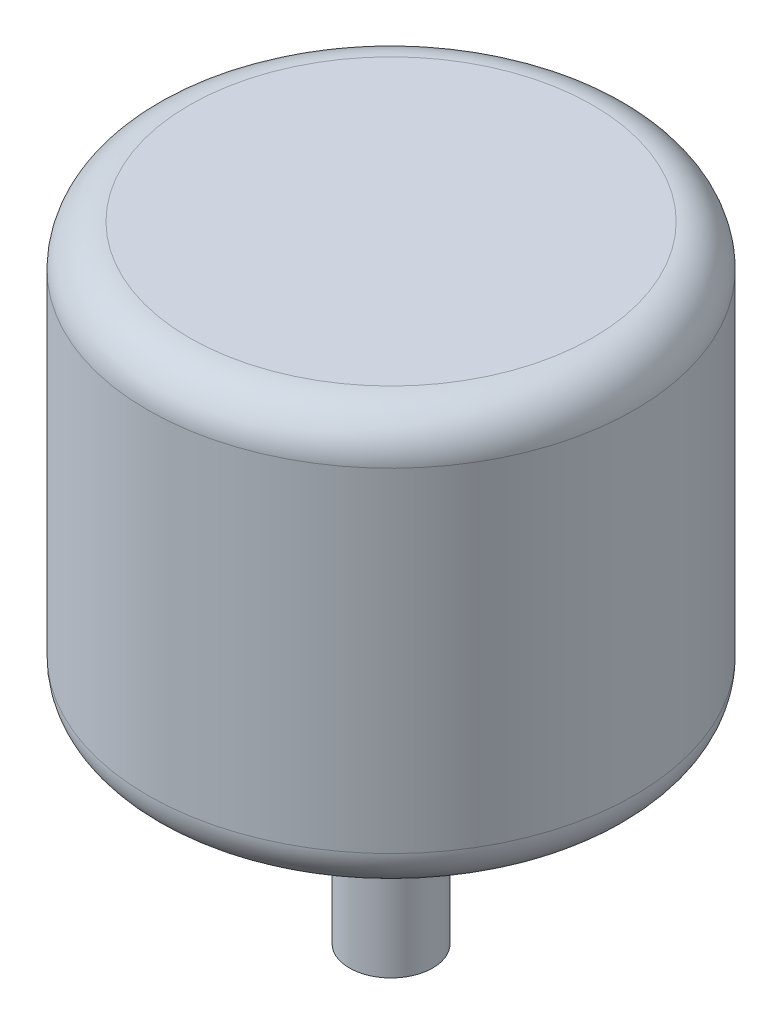
ISO-10303-21;
HEADER;
FILE_DESCRIPTION(('STEP AP214'),'2;1');
FILE_NAME('part.step','',(''),(''),'','','');
FILE_SCHEMA(('AUTOMOTIVE_DESIGN { 1 0 10303 214 1 1 1 1 }'));
ENDSEC;
DATA;
#1=APPLICATION_CONTEXT('core data for automotive mechanical design processes');
#2=APPLICATION_PROTOCOL_DEFINITION('international standard','automotive_design',2000,#1);
#3=PRODUCT_CONTEXT('',#1,'mechanical');
#4=PRODUCT('Part','Part','',(#3));
#5=PRODUCT_RELATED_PRODUCT_CATEGORY('part','',(#4));
#6=PRODUCT_DEFINITION_FORMATION('','',#4);
#7=PRODUCT_DEFINITION_CONTEXT('part definition',#1,'design');
#8=PRODUCT_DEFINITION('design','',#6,#7);
#9=PRODUCT_DEFINITION_SHAPE('','',#8);
#10=(LENGTH_UNIT() NAMED_UNIT(*) SI_UNIT(.MILLI.,.METRE.));
#11=(NAMED_UNIT(*) PLANE_ANGLE_UNIT() SI_UNIT($,.RADIAN.));
#12=(NAMED_UNIT(*) SI_UNIT($,.STERADIAN.) SOLID_ANGLE_UNIT());
#13=UNCERTAINTY_MEASURE_WITH_UNIT(LENGTH_MEASURE(1.E-05),#10,'distance_accuracy_value','');
#14=(GEOMETRIC_REPRESENTATION_CONTEXT(3) GLOBAL_UNCERTAINTY_ASSIGNED_CONTEXT((#13)) GLOBAL_UNIT_ASSIGNED_CONTEXT((#10,
#11,#12)) REPRESENTATION_CONTEXT('',''));
#15=CARTESIAN_POINT('',(0.,0.,0.));
#16=DIRECTION('',(0.,0.,1.));
#17=DIRECTION('',(1.,0.,0.));
#18=AXIS2_PLACEMENT_3D('',#15,#16,#17);
#19=CARTESIAN_POINT('',(0.,30.,0.));
#20=DIRECTION('',(0.,-1.,0.));
#21=DIRECTION('',(0.,0.,-1.));
#22=AXIS2_PLACEMENT_3D('',#19,#20,#21);
#23=CYLINDRICAL_SURFACE('',#22,17.5);
#24=CARTESIAN_POINT('',(0.,27.,0.));
#25=DIRECTION('',(0.,1.,0.));
#26=DIRECTION('',(0.,0.,1.));
#27=AXIS2_PLACEMENT_3D('',#24,#25,#26);
#28=CIRCLE('',#27,17.5);
#29=CARTESIAN_POINT('',(0.,27.,17.5));
#30=VERTEX_POINT('',#29);
#31=EDGE_CURVE('E51',#30,#30,#28,.F.);
#32=ORIENTED_EDGE('',*,*,#31,.T.);
#33=EDGE_LOOP('',(#32));
#34=FACE_BOUND('',#33,.T.);
#35=CARTESIAN_POINT('',(0.,3.,0.));
#36=DIRECTION('',(0.,1.,0.));
#37=DIRECTION('',(0.,0.,1.));
#38=AXIS2_PLACEMENT_3D('',#35,#36,#37);
#39=CIRCLE('',#38,17.5);
#40=CARTESIAN_POINT('',(0.,3.,17.5));
#41=VERTEX_POINT('',#40);
#42=EDGE_CURVE('E56',#41,#41,#39,.T.);
#43=ORIENTED_EDGE('',*,*,#42,.T.);
#44=EDGE_LOOP('',(#43));
#45=FACE_BOUND('',#44,.T.);
#46=ADVANCED_FACE('F43',(#34,#45),#23,.T.);
#47=CARTESIAN_POINT('',(0.,30.,0.));
#48=DIRECTION('',(0.,1.,0.));
#49=DIRECTION('',(0.,0.,1.));
#50=AXIS2_PLACEMENT_3D('',#47,#48,#49);
#51=PLANE('',#50);
#52=CARTESIAN_POINT('',(0.,30.,0.));
#53=DIRECTION('',(0.,1.,0.));
#54=DIRECTION('',(0.,0.,1.));
#55=AXIS2_PLACEMENT_3D('',#52,#53,#54);
#56=CIRCLE('',#55,14.5);
#57=CARTESIAN_POINT('',(0.,30.,14.5));
#58=VERTEX_POINT('',#57);
#59=EDGE_CURVE('E80',#58,#58,#56,.T.);
#60=ORIENTED_EDGE('',*,*,#59,.T.);
#61=EDGE_LOOP('',(#60));
#62=FACE_BOUND('',#61,.T.);
#63=ADVANCED_FACE('F106',(#62),#51,.T.);
#64=CARTESIAN_POINT('',(0.,0.,0.));
#65=DIRECTION('',(0.,1.,0.));
#66=DIRECTION('',(0.,0.,1.));
#67=AXIS2_PLACEMENT_3D('',#64,#65,#66);
#68=PLANE('',#67);
#69=CARTESIAN_POINT('',(7.28770078599683,0.,3.29991170393618));
#70=DIRECTION('',(0.,1.,0.));
#71=DIRECTION('',(0.,0.,1.));
#72=AXIS2_PLACEMENT_3D('',#69,#70,#71);
#73=CIRCLE('',#72,1.50000000000008);
#74=CARTESIAN_POINT('',(7.28770078599683,0.,4.79991170393625));
#75=VERTEX_POINT('',#74);
#76=EDGE_CURVE('E47',#75,#75,#73,.T.);
#77=ORIENTED_EDGE('',*,*,#76,.T.);
#78=EDGE_LOOP('',(#77));
#79=FACE_BOUND('',#78,.T.);
#80=CARTESIAN_POINT('',(3.29991170393606,0.,-7.28770078599739));
#81=DIRECTION('',(0.,1.,0.));
#82=DIRECTION('',(0.,0.,1.));
#83=AXIS2_PLACEMENT_3D('',#80,#81,#82);
#84=CIRCLE('',#83,1.50000000000011);
#85=CARTESIAN_POINT('',(3.29991170393606,0.,-5.78770078599727));
#86=VERTEX_POINT('',#85);
#87=EDGE_CURVE('E66',#86,#86,#84,.T.);
#88=ORIENTED_EDGE('',*,*,#87,.T.);
#89=EDGE_LOOP('',(#88));
#90=FACE_BOUND('',#89,.T.);
#91=CARTESIAN_POINT('',(-7.28770078599761,0.,-3.29991170393662));
#92=DIRECTION('',(0.,1.,0.));
#93=DIRECTION('',(0.,0.,1.));
#94=AXIS2_PLACEMENT_3D('',#91,#92,#93);
#95=CIRCLE('',#94,1.50000000000016);
#96=CARTESIAN_POINT('',(-7.28770078599761,0.,-1.79991170393646));
#97=VERTEX_POINT('',#96);
#98=EDGE_CURVE('E63',#97,#97,#95,.T.);
#99=ORIENTED_EDGE('',*,*,#98,.T.);
#100=EDGE_LOOP('',(#99));
#101=FACE_BOUND('',#100,.T.);
#102=CARTESIAN_POINT('',(-3.29991170393662,0.,7.28770078599705));
#103=DIRECTION('',(0.,1.,0.));
#104=DIRECTION('',(0.,0.,1.));
#105=AXIS2_PLACEMENT_3D('',#102,#103,#104);
#106=CIRCLE('',#105,1.50000000000012);
#107=CARTESIAN_POINT('',(-3.29991170393662,0.,8.78770078599718));
#108=VERTEX_POINT('',#107);
#109=EDGE_CURVE('E60',#108,#108,#106,.T.);
#110=ORIENTED_EDGE('',*,*,#109,.T.);
#111=EDGE_LOOP('',(#110));
#112=FACE_BOUND('',#111,.T.);
#113=CARTESIAN_POINT('',(0.,0.,0.));
#114=DIRECTION('',(0.,1.,0.));
#115=DIRECTION('',(0.,0.,1.));
#116=AXIS2_PLACEMENT_3D('',#113,#114,#115);
#117=CIRCLE('',#116,14.5);
#118=CARTESIAN_POINT('',(0.,0.,14.5));
#119=VERTEX_POINT('',#118);
#120=EDGE_CURVE('E10',#119,#119,#117,.F.);
#121=ORIENTED_EDGE('',*,*,#120,.T.);
#122=EDGE_LOOP('',(#121));
#123=FACE_BOUND('',#122,.T.);
#124=CARTESIAN_POINT('',(0.,0.,0.));
#125=DIRECTION('',(0.,-1.,0.));
#126=DIRECTION('',(0.,0.,-1.));
#127=AXIS2_PLACEMENT_3D('',#124,#125,#126);
#128=CIRCLE('',#127,3.);
#129=CARTESIAN_POINT('',(0.,0.,-3.));
#130=VERTEX_POINT('',#129);
#131=EDGE_CURVE('E75',#130,#130,#128,.T.);
#132=ORIENTED_EDGE('',*,*,#131,.F.);
#133=EDGE_LOOP('',(#132));
#134=FACE_BOUND('',#133,.T.);
#135=ADVANCED_FACE('F113',(#79,#90,#101,#112,#123,#134),#68,.F.);
#136=CARTESIAN_POINT('',(0.,-15.,0.));
#137=DIRECTION('',(0.,1.,0.));
#138=DIRECTION('',(0.,0.,1.));
#139=AXIS2_PLACEMENT_3D('',#136,#137,#138);
#140=CYLINDRICAL_SURFACE('',#139,3.);
#141=CARTESIAN_POINT('',(0.,-15.,0.));
#142=DIRECTION('',(0.,-1.,0.));
#143=DIRECTION('',(0.,0.,-1.));
#144=AXIS2_PLACEMENT_3D('',#141,#142,#143);
#145=CIRCLE('',#144,3.);
#146=CARTESIAN_POINT('',(0.,-15.,-3.));
#147=VERTEX_POINT('',#146);
#148=EDGE_CURVE('E71',#147,#147,#145,.T.);
#149=ORIENTED_EDGE('',*,*,#148,.F.);
#150=EDGE_LOOP('',(#149));
#151=FACE_BOUND('',#150,.T.);
#152=ORIENTED_EDGE('',*,*,#131,.T.);
#153=EDGE_LOOP('',(#152));
#154=FACE_BOUND('',#153,.T.);
#155=ADVANCED_FACE('F117',(#151,#154),#140,.T.);
#156=CARTESIAN_POINT('',(0.,-15.,0.));
#157=DIRECTION('',(0.,-1.,0.));
#158=DIRECTION('',(0.,0.,-1.));
#159=AXIS2_PLACEMENT_3D('',#156,#157,#158);
#160=PLANE('',#159);
#161=ORIENTED_EDGE('',*,*,#148,.T.);
#162=EDGE_LOOP('',(#161));
#163=FACE_BOUND('',#162,.T.);
#164=ADVANCED_FACE('F103',(#163),#160,.T.);
#165=CARTESIAN_POINT('',(0.,27.,0.));
#166=DIRECTION('',(0.,1.,0.));
#167=DIRECTION('',(0.,0.,1.));
#168=AXIS2_PLACEMENT_3D('',#165,#166,#167);
#169=TOROIDAL_SURFACE('',#168,14.5,3.);
#170=ORIENTED_EDGE('',*,*,#31,.F.);
#171=EDGE_LOOP('',(#170));
#172=FACE_BOUND('',#171,.T.);
#173=ORIENTED_EDGE('',*,*,#59,.F.);
#174=EDGE_LOOP('',(#173));
#175=FACE_BOUND('',#174,.T.);
#176=ADVANCED_FACE('F93',(#172,#175),#169,.T.);
#177=CARTESIAN_POINT('',(0.,3.,0.));
#178=DIRECTION('',(0.,1.,0.));
#179=DIRECTION('',(0.,0.,1.));
#180=AXIS2_PLACEMENT_3D('',#177,#178,#179);
#181=TOROIDAL_SURFACE('',#180,14.5,3.);
#182=ORIENTED_EDGE('',*,*,#120,.F.);
#183=EDGE_LOOP('',(#182));
#184=FACE_BOUND('',#183,.T.);
#185=ORIENTED_EDGE('',*,*,#42,.F.);
#186=EDGE_LOOP('',(#185));
#187=FACE_BOUND('',#186,.T.);
#188=ADVANCED_FACE('F45',(#184,#187),#181,.T.);
#189=CARTESIAN_POINT('',(-3.29991170393662,8.00000000000008,7.28770078599705));
#190=DIRECTION('',(0.,-1.,0.));
#191=DIRECTION('',(0.,0.,-1.));
#192=AXIS2_PLACEMENT_3D('',#189,#190,#191);
#193=CYLINDRICAL_SURFACE('',#192,1.50000000000012);
#194=CARTESIAN_POINT('',(-3.29991170393662,8.00000000000008,7.28770078599705));
#195=DIRECTION('',(0.,-1.,0.));
#196=DIRECTION('',(0.,0.,-1.));
#197=AXIS2_PLACEMENT_3D('',#194,#195,#196);
#198=CIRCLE('',#197,1.50000000000012);
#199=CARTESIAN_POINT('',(-3.29991170393662,8.00000000000008,5.78770078599693));
#200=VERTEX_POINT('',#199);
#201=EDGE_CURVE('E83',#200,#200,#198,.T.);
#202=ORIENTED_EDGE('',*,*,#201,.F.);
#203=EDGE_LOOP('',(#202));
#204=FACE_BOUND('',#203,.T.);
#205=ORIENTED_EDGE('',*,*,#109,.F.);
#206=EDGE_LOOP('',(#205));
#207=FACE_BOUND('',#206,.T.);
#208=ADVANCED_FACE('F92',(#204,#207),#193,.F.);
#209=CARTESIAN_POINT('',(-3.29991170393662,8.00000000000008,7.28770078599705));
#210=DIRECTION('',(0.,-1.,0.));
#211=DIRECTION('',(0.,0.,-1.));
#212=AXIS2_PLACEMENT_3D('',#209,#210,#211);
#213=PLANE('',#212);
#214=ORIENTED_EDGE('',*,*,#201,.T.);
#215=EDGE_LOOP('',(#214));
#216=FACE_BOUND('',#215,.T.);
#217=ADVANCED_FACE('F100',(#216),#213,.T.);
#218=CARTESIAN_POINT('',(-7.28770078599761,8.00000000000008,-3.29991170393662));
#219=DIRECTION('',(0.,-1.,0.));
#220=DIRECTION('',(0.,0.,-1.));
#221=AXIS2_PLACEMENT_3D('',#218,#219,#220);
#222=CYLINDRICAL_SURFACE('',#221,1.50000000000016);
#223=CARTESIAN_POINT('',(-7.28770078599761,8.00000000000008,-3.29991170393662));
#224=DIRECTION('',(0.,-1.,0.));
#225=DIRECTION('',(0.,0.,-1.));
#226=AXIS2_PLACEMENT_3D('',#223,#224,#225);
#227=CIRCLE('',#226,1.50000000000016);
#228=CARTESIAN_POINT('',(-7.28770078599761,8.00000000000008,-4.79991170393678));
#229=VERTEX_POINT('',#228);
#230=EDGE_CURVE('E157',#229,#229,#227,.T.);
#231=ORIENTED_EDGE('',*,*,#230,.F.);
#232=EDGE_LOOP('',(#231));
#233=FACE_BOUND('',#232,.T.);
#234=ORIENTED_EDGE('',*,*,#98,.F.);
#235=EDGE_LOOP('',(#234));
#236=FACE_BOUND('',#235,.T.);
#237=ADVANCED_FACE('F125',(#233,#236),#222,.F.);
#238=CARTESIAN_POINT('',(-7.28770078599761,8.00000000000008,-3.29991170393662));
#239=DIRECTION('',(0.,-1.,0.));
#240=DIRECTION('',(0.,0.,-1.));
#241=AXIS2_PLACEMENT_3D('',#238,#239,#240);
#242=PLANE('',#241);
#243=ORIENTED_EDGE('',*,*,#230,.T.);
#244=EDGE_LOOP('',(#243));
#245=FACE_BOUND('',#244,.T.);
#246=ADVANCED_FACE('F128',(#245),#242,.T.);
#247=CARTESIAN_POINT('',(3.29991170393606,8.00000000000008,-7.28770078599739));
#248=DIRECTION('',(0.,-1.,0.));
#249=DIRECTION('',(0.,0.,-1.));
#250=AXIS2_PLACEMENT_3D('',#247,#248,#249);
#251=CYLINDRICAL_SURFACE('',#250,1.50000000000011);
#252=CARTESIAN_POINT('',(3.29991170393606,8.00000000000008,-7.28770078599739));
#253=DIRECTION('',(0.,-1.,0.));
#254=DIRECTION('',(0.,0.,-1.));
#255=AXIS2_PLACEMENT_3D('',#252,#253,#254);
#256=CIRCLE('',#255,1.50000000000011);
#257=CARTESIAN_POINT('',(3.29991170393606,8.00000000000008,-8.7877007859975));
#258=VERTEX_POINT('',#257);
#259=EDGE_CURVE('E154',#258,#258,#256,.T.);
#260=ORIENTED_EDGE('',*,*,#259,.F.);
#261=EDGE_LOOP('',(#260));
#262=FACE_BOUND('',#261,.T.);
#263=ORIENTED_EDGE('',*,*,#87,.F.);
#264=EDGE_LOOP('',(#263));
#265=FACE_BOUND('',#264,.T.);
#266=ADVANCED_FACE('F131',(#262,#265),#251,.F.);
#267=CARTESIAN_POINT('',(3.29991170393606,8.00000000000008,-7.28770078599739));
#268=DIRECTION('',(0.,-1.,0.));
#269=DIRECTION('',(0.,0.,-1.));
#270=AXIS2_PLACEMENT_3D('',#267,#268,#269);
#271=PLANE('',#270);
#272=ORIENTED_EDGE('',*,*,#259,.T.);
#273=EDGE_LOOP('',(#272));
#274=FACE_BOUND('',#273,.T.);
#275=ADVANCED_FACE('F136',(#274),#271,.T.);
#276=CARTESIAN_POINT('',(7.28770078599683,8.00000000000008,3.29991170393618));
#277=DIRECTION('',(0.,-1.,0.));
#278=DIRECTION('',(0.,0.,-1.));
#279=AXIS2_PLACEMENT_3D('',#276,#277,#278);
#280=CYLINDRICAL_SURFACE('',#279,1.50000000000008);
#281=CARTESIAN_POINT('',(7.28770078599683,8.00000000000008,3.29991170393618));
#282=DIRECTION('',(0.,-1.,0.));
#283=DIRECTION('',(0.,0.,-1.));
#284=AXIS2_PLACEMENT_3D('',#281,#282,#283);
#285=CIRCLE('',#284,1.50000000000008);
#286=CARTESIAN_POINT('',(7.28770078599683,8.00000000000008,1.7999117039361));
#287=VERTEX_POINT('',#286);
#288=EDGE_CURVE('E64',#287,#287,#285,.T.);
#289=ORIENTED_EDGE('',*,*,#288,.F.);
#290=EDGE_LOOP('',(#289));
#291=FACE_BOUND('',#290,.T.);
#292=ORIENTED_EDGE('',*,*,#76,.F.);
#293=EDGE_LOOP('',(#292));
#294=FACE_BOUND('',#293,.T.);
#295=ADVANCED_FACE('F139',(#291,#294),#280,.F.);
#296=CARTESIAN_POINT('',(7.28770078599683,8.00000000000008,3.29991170393618));
#297=DIRECTION('',(0.,-1.,0.));
#298=DIRECTION('',(0.,0.,-1.));
#299=AXIS2_PLACEMENT_3D('',#296,#297,#298);
#300=PLANE('',#299);
#301=ORIENTED_EDGE('',*,*,#288,.T.);
#302=EDGE_LOOP('',(#301));
#303=FACE_BOUND('',#302,.T.);
#304=ADVANCED_FACE('F146',(#303),#300,.T.);
#305=CLOSED_SHELL('',(#46,#63,#135,#155,#164,#176,#188,#208,#217,#237,#246,#266,#275,#295,#304));
#306=MANIFOLD_SOLID_BREP('B2',#305);
#307=ADVANCED_BREP_SHAPE_REPRESENTATION('',(#18,#306),#14);
#308=SHAPE_DEFINITION_REPRESENTATION(#9,#307);
ENDSEC;
END-ISO-10303-21;
